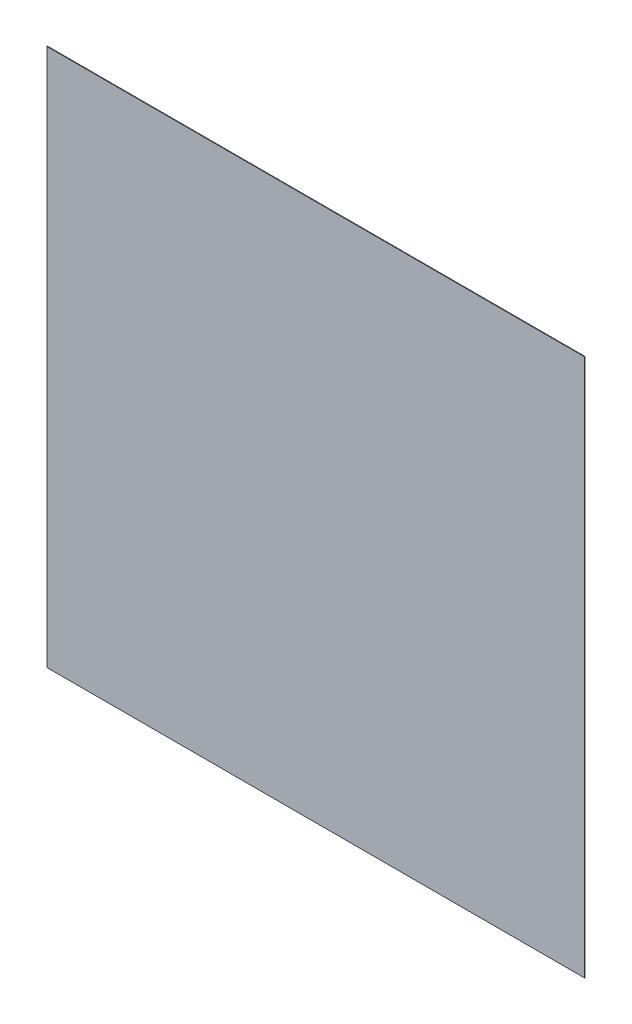
ISO-10303-21;
HEADER;
FILE_DESCRIPTION(('STEP AP214'),'2;1');
FILE_NAME('part.step','',(''),(''),'','','');
FILE_SCHEMA(('AUTOMOTIVE_DESIGN { 1 0 10303 214 1 1 1 1 }'));
ENDSEC;
DATA;
#1=APPLICATION_CONTEXT('core data for automotive mechanical design processes');
#2=APPLICATION_PROTOCOL_DEFINITION('international standard','automotive_design',2000,#1);
#3=PRODUCT_CONTEXT('',#1,'mechanical');
#4=PRODUCT('Part','Part','',(#3));
#5=PRODUCT_RELATED_PRODUCT_CATEGORY('part','',(#4));
#6=PRODUCT_DEFINITION_FORMATION('','',#4);
#7=PRODUCT_DEFINITION_CONTEXT('part definition',#1,'design');
#8=PRODUCT_DEFINITION('design','',#6,#7);
#9=PRODUCT_DEFINITION_SHAPE('','',#8);
#10=(LENGTH_UNIT() NAMED_UNIT(*) SI_UNIT(.MILLI.,.METRE.));
#11=(NAMED_UNIT(*) PLANE_ANGLE_UNIT() SI_UNIT($,.RADIAN.));
#12=(NAMED_UNIT(*) SI_UNIT($,.STERADIAN.) SOLID_ANGLE_UNIT());
#13=UNCERTAINTY_MEASURE_WITH_UNIT(LENGTH_MEASURE(1.E-05),#10,'distance_accuracy_value','');
#14=(GEOMETRIC_REPRESENTATION_CONTEXT(3) GLOBAL_UNCERTAINTY_ASSIGNED_CONTEXT((#13)) GLOBAL_UNIT_ASSIGNED_CONTEXT((#10,
#11,#12)) REPRESENTATION_CONTEXT('',''));
#15=CARTESIAN_POINT('',(0.,0.,0.));
#16=DIRECTION('',(0.,0.,1.));
#17=DIRECTION('',(1.,0.,0.));
#18=AXIS2_PLACEMENT_3D('',#15,#16,#17);
#19=CARTESIAN_POINT('',(0.,0.,0.01));
#20=DIRECTION('',(0.,0.,1.));
#21=DIRECTION('',(1.,0.,0.));
#22=AXIS2_PLACEMENT_3D('',#19,#20,#21);
#23=PLANE('',#22);
#24=DIRECTION('',(1.,0.,0.));
#25=VECTOR('',#24,1.);
#26=CARTESIAN_POINT('',(9.,9.,0.01));
#27=LINE('',#26,#25);
#28=CARTESIAN_POINT('',(0.,9.,0.01));
#29=VERTEX_POINT('',#28);
#30=CARTESIAN_POINT('',(9.,9.,0.01));
#31=VERTEX_POINT('',#30);
#32=EDGE_CURVE('E68',#29,#31,#27,.T.);
#33=ORIENTED_EDGE('',*,*,#32,.F.);
#34=DIRECTION('',(0.,1.,0.));
#35=VECTOR('',#34,1.);
#36=CARTESIAN_POINT('',(0.,9.,0.01));
#37=LINE('',#36,#35);
#38=CARTESIAN_POINT('',(0.,0.,0.01));
#39=VERTEX_POINT('',#38);
#40=EDGE_CURVE('E20',#39,#29,#37,.T.);
#41=ORIENTED_EDGE('',*,*,#40,.F.);
#42=DIRECTION('',(1.,0.,0.));
#43=VECTOR('',#42,1.);
#44=CARTESIAN_POINT('',(0.,0.,0.01));
#45=LINE('',#44,#43);
#46=CARTESIAN_POINT('',(9.,0.,0.01));
#47=VERTEX_POINT('',#46);
#48=EDGE_CURVE('E58',#47,#39,#45,.F.);
#49=ORIENTED_EDGE('',*,*,#48,.F.);
#50=DIRECTION('',(0.,1.,0.));
#51=VECTOR('',#50,1.);
#52=CARTESIAN_POINT('',(9.,0.,0.01));
#53=LINE('',#52,#51);
#54=EDGE_CURVE('E53',#31,#47,#53,.F.);
#55=ORIENTED_EDGE('',*,*,#54,.F.);
#56=EDGE_LOOP('',(#33,#41,#49,#55));
#57=FACE_BOUND('',#56,.T.);
#58=ADVANCED_FACE('F17',(#57),#23,.T.);
#59=CARTESIAN_POINT('',(0.,9.,0.));
#60=DIRECTION('',(-1.,0.,0.));
#61=DIRECTION('',(0.,0.,1.));
#62=AXIS2_PLACEMENT_3D('',#59,#60,#61);
#63=PLANE('',#62);
#64=DIRECTION('',(0.,0.,1.));
#65=VECTOR('',#64,1.);
#66=CARTESIAN_POINT('',(0.,9.,0.));
#67=LINE('',#66,#65);
#68=CARTESIAN_POINT('',(0.,9.,0.));
#69=VERTEX_POINT('',#68);
#70=EDGE_CURVE('E79',#69,#29,#67,.T.);
#71=ORIENTED_EDGE('',*,*,#70,.F.);
#72=DIRECTION('',(0.,1.,0.));
#73=VECTOR('',#72,1.);
#74=CARTESIAN_POINT('',(0.,0.,0.));
#75=LINE('',#74,#73);
#76=CARTESIAN_POINT('',(0.,0.,0.));
#77=VERTEX_POINT('',#76);
#78=EDGE_CURVE('E74',#69,#77,#75,.F.);
#79=ORIENTED_EDGE('',*,*,#78,.T.);
#80=DIRECTION('',(0.,0.,-1.));
#81=VECTOR('',#80,1.);
#82=CARTESIAN_POINT('',(0.,0.,0.));
#83=LINE('',#82,#81);
#84=EDGE_CURVE('E63',#39,#77,#83,.T.);
#85=ORIENTED_EDGE('',*,*,#84,.F.);
#86=ORIENTED_EDGE('',*,*,#40,.T.);
#87=EDGE_LOOP('',(#71,#79,#85,#86));
#88=FACE_BOUND('',#87,.T.);
#89=ADVANCED_FACE('F73',(#88),#63,.T.);
#90=CARTESIAN_POINT('',(0.,0.,0.));
#91=DIRECTION('',(0.,-1.,0.));
#92=DIRECTION('',(0.,0.,-1.));
#93=AXIS2_PLACEMENT_3D('',#90,#91,#92);
#94=PLANE('',#93);
#95=ORIENTED_EDGE('',*,*,#84,.T.);
#96=DIRECTION('',(1.,0.,0.));
#97=VECTOR('',#96,1.);
#98=CARTESIAN_POINT('',(0.,0.,0.));
#99=LINE('',#98,#97);
#100=CARTESIAN_POINT('',(9.,0.,0.));
#101=VERTEX_POINT('',#100);
#102=EDGE_CURVE('E84',#77,#101,#99,.T.);
#103=ORIENTED_EDGE('',*,*,#102,.T.);
#104=DIRECTION('',(0.,0.,-1.));
#105=VECTOR('',#104,1.);
#106=CARTESIAN_POINT('',(9.,0.,0.));
#107=LINE('',#106,#105);
#108=EDGE_CURVE('E65',#47,#101,#107,.T.);
#109=ORIENTED_EDGE('',*,*,#108,.F.);
#110=ORIENTED_EDGE('',*,*,#48,.T.);
#111=EDGE_LOOP('',(#95,#103,#109,#110));
#112=FACE_BOUND('',#111,.T.);
#113=ADVANCED_FACE('F60',(#112),#94,.T.);
#114=CARTESIAN_POINT('',(9.,0.,0.));
#115=DIRECTION('',(1.,0.,0.));
#116=DIRECTION('',(0.,0.,-1.));
#117=AXIS2_PLACEMENT_3D('',#114,#115,#116);
#118=PLANE('',#117);
#119=ORIENTED_EDGE('',*,*,#108,.T.);
#120=DIRECTION('',(0.,1.,0.));
#121=VECTOR('',#120,1.);
#122=CARTESIAN_POINT('',(9.,0.,0.));
#123=LINE('',#122,#121);
#124=CARTESIAN_POINT('',(9.,9.,0.));
#125=VERTEX_POINT('',#124);
#126=EDGE_CURVE('E26',#101,#125,#123,.T.);
#127=ORIENTED_EDGE('',*,*,#126,.T.);
#128=DIRECTION('',(0.,0.,1.));
#129=VECTOR('',#128,1.);
#130=CARTESIAN_POINT('',(9.,9.,0.));
#131=LINE('',#130,#129);
#132=EDGE_CURVE('E34',#31,#125,#131,.F.);
#133=ORIENTED_EDGE('',*,*,#132,.F.);
#134=ORIENTED_EDGE('',*,*,#54,.T.);
#135=EDGE_LOOP('',(#119,#127,#133,#134));
#136=FACE_BOUND('',#135,.T.);
#137=ADVANCED_FACE('F88',(#136),#118,.T.);
#138=CARTESIAN_POINT('',(9.,9.,0.));
#139=DIRECTION('',(0.,1.,0.));
#140=DIRECTION('',(0.,0.,1.));
#141=AXIS2_PLACEMENT_3D('',#138,#139,#140);
#142=PLANE('',#141);
#143=ORIENTED_EDGE('',*,*,#132,.T.);
#144=DIRECTION('',(1.,0.,0.));
#145=VECTOR('',#144,1.);
#146=CARTESIAN_POINT('',(0.,9.,0.));
#147=LINE('',#146,#145);
#148=EDGE_CURVE('E11',#125,#69,#147,.F.);
#149=ORIENTED_EDGE('',*,*,#148,.T.);
#150=ORIENTED_EDGE('',*,*,#70,.T.);
#151=ORIENTED_EDGE('',*,*,#32,.T.);
#152=EDGE_LOOP('',(#143,#149,#150,#151));
#153=FACE_BOUND('',#152,.T.);
#154=ADVANCED_FACE('F91',(#153),#142,.T.);
#155=CARTESIAN_POINT('',(0.,0.,0.));
#156=DIRECTION('',(0.,0.,1.));
#157=DIRECTION('',(1.,0.,0.));
#158=AXIS2_PLACEMENT_3D('',#155,#156,#157);
#159=PLANE('',#158);
#160=ORIENTED_EDGE('',*,*,#126,.F.);
#161=ORIENTED_EDGE('',*,*,#102,.F.);
#162=ORIENTED_EDGE('',*,*,#78,.F.);
#163=ORIENTED_EDGE('',*,*,#148,.F.);
#164=EDGE_LOOP('',(#160,#161,#162,#163));
#165=FACE_BOUND('',#164,.T.);
#166=ADVANCED_FACE('F90',(#165),#159,.F.);
#167=CLOSED_SHELL('',(#58,#89,#113,#137,#154,#166));
#168=MANIFOLD_SOLID_BREP('B1',#167);
#169=ADVANCED_BREP_SHAPE_REPRESENTATION('',(#18,#168),#14);
#170=SHAPE_DEFINITION_REPRESENTATION(#9,#169);
ENDSEC;
END-ISO-10303-21;
